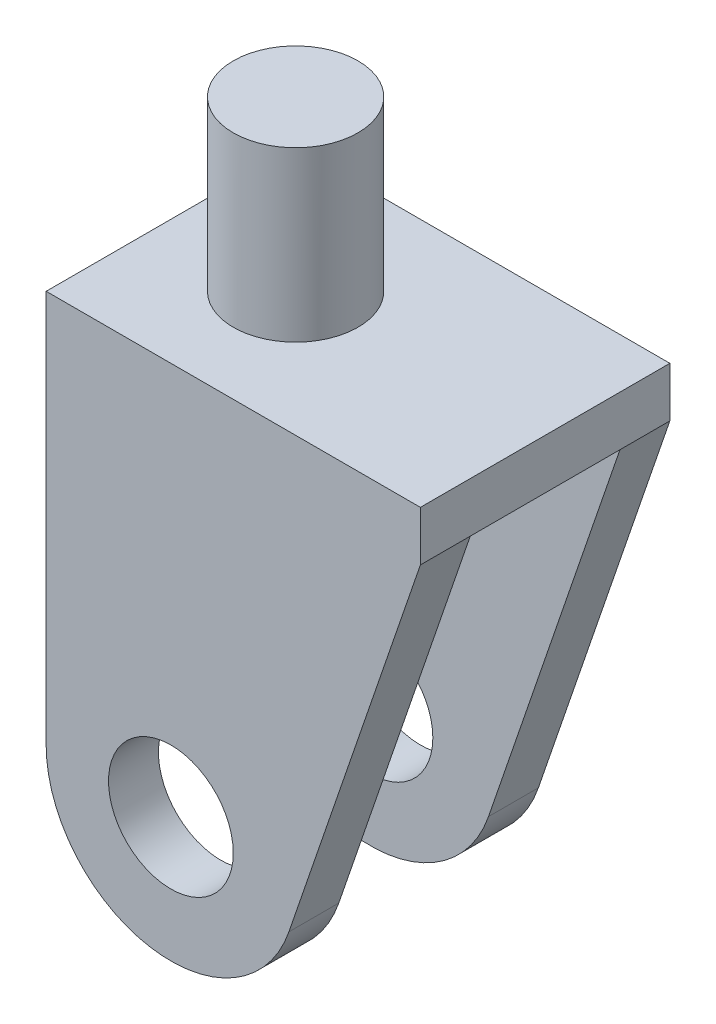
ISO-10303-21;
HEADER;
FILE_DESCRIPTION(('STEP AP214'),'2;1');
FILE_NAME('part.step','',(''),(''),'','','');
FILE_SCHEMA(('AUTOMOTIVE_DESIGN { 1 0 10303 214 1 1 1 1 }'));
ENDSEC;
DATA;
#1=APPLICATION_CONTEXT('core data for automotive mechanical design processes');
#2=APPLICATION_PROTOCOL_DEFINITION('international standard','automotive_design',2000,#1);
#3=PRODUCT_CONTEXT('',#1,'mechanical');
#4=PRODUCT('Part','Part','',(#3));
#5=PRODUCT_RELATED_PRODUCT_CATEGORY('part','',(#4));
#6=PRODUCT_DEFINITION_FORMATION('','',#4);
#7=PRODUCT_DEFINITION_CONTEXT('part definition',#1,'design');
#8=PRODUCT_DEFINITION('design','',#6,#7);
#9=PRODUCT_DEFINITION_SHAPE('','',#8);
#10=(LENGTH_UNIT() NAMED_UNIT(*) SI_UNIT(.MILLI.,.METRE.));
#11=(NAMED_UNIT(*) PLANE_ANGLE_UNIT() SI_UNIT($,.RADIAN.));
#12=(NAMED_UNIT(*) SI_UNIT($,.STERADIAN.) SOLID_ANGLE_UNIT());
#13=UNCERTAINTY_MEASURE_WITH_UNIT(LENGTH_MEASURE(1.E-05),#10,'distance_accuracy_value','');
#14=(GEOMETRIC_REPRESENTATION_CONTEXT(3) GLOBAL_UNCERTAINTY_ASSIGNED_CONTEXT((#13)) GLOBAL_UNIT_ASSIGNED_CONTEXT((#10,
#11,#12)) REPRESENTATION_CONTEXT('',''));
#15=CARTESIAN_POINT('',(0.,0.,0.));
#16=DIRECTION('',(0.,0.,1.));
#17=DIRECTION('',(1.,0.,0.));
#18=AXIS2_PLACEMENT_3D('',#15,#16,#17);
#19=CARTESIAN_POINT('',(-20.0000001154631,55.,20.));
#20=DIRECTION('',(1.,0.,0.));
#21=DIRECTION('',(0.,1.,0.));
#22=AXIS2_PLACEMENT_3D('',#19,#20,#21);
#23=PLANE('',#22);
#24=DIRECTION('',(0.,-1.,0.));
#25=VECTOR('',#24,1.);
#26=CARTESIAN_POINT('',(-20.0000001154631,55.,-12.));
#27=LINE('',#26,#25);
#28=CARTESIAN_POINT('',(-20.0000001154631,55.,-12.));
#29=VERTEX_POINT('',#28);
#30=CARTESIAN_POINT('',(-20.0000001154631,0.,-12.));
#31=VERTEX_POINT('',#30);
#32=EDGE_CURVE('E196',#29,#31,#27,.T.);
#33=ORIENTED_EDGE('',*,*,#32,.F.);
#34=DIRECTION('',(0.,0.,1.));
#35=VECTOR('',#34,1.);
#36=CARTESIAN_POINT('',(-20.0000001154631,55.,-12.));
#37=LINE('',#36,#35);
#38=CARTESIAN_POINT('',(-20.0000001154631,55.,12.));
#39=VERTEX_POINT('',#38);
#40=EDGE_CURVE('E151',#29,#39,#37,.T.);
#41=ORIENTED_EDGE('',*,*,#40,.T.);
#42=DIRECTION('',(0.,-1.,0.));
#43=VECTOR('',#42,1.);
#44=CARTESIAN_POINT('',(-20.0000001154631,55.,12.));
#45=LINE('',#44,#43);
#46=CARTESIAN_POINT('',(-20.0000001154631,0.,12.));
#47=VERTEX_POINT('',#46);
#48=EDGE_CURVE('E113',#39,#47,#45,.T.);
#49=ORIENTED_EDGE('',*,*,#48,.T.);
#50=DIRECTION('',(0.,0.,-1.));
#51=VECTOR('',#50,1.);
#52=CARTESIAN_POINT('',(-20.0000001154631,0.,20.));
#53=LINE('',#52,#51);
#54=CARTESIAN_POINT('',(-20.0000001154631,0.,20.));
#55=VERTEX_POINT('',#54);
#56=EDGE_CURVE('E110',#55,#47,#53,.T.);
#57=ORIENTED_EDGE('',*,*,#56,.F.);
#58=DIRECTION('',(0.,-1.,0.));
#59=VECTOR('',#58,1.);
#60=CARTESIAN_POINT('',(-20.0000001154631,55.,20.));
#61=LINE('',#60,#59);
#62=CARTESIAN_POINT('',(-20.0000001154631,63.,20.));
#63=VERTEX_POINT('',#62);
#64=EDGE_CURVE('E98',#63,#55,#61,.T.);
#65=ORIENTED_EDGE('',*,*,#64,.F.);
#66=DIRECTION('',(0.,0.,-1.));
#67=VECTOR('',#66,1.);
#68=CARTESIAN_POINT('',(-20.0000001154631,63.,20.));
#69=LINE('',#68,#67);
#70=CARTESIAN_POINT('',(-20.0000001154631,63.,-20.));
#71=VERTEX_POINT('',#70);
#72=EDGE_CURVE('E116',#63,#71,#69,.T.);
#73=ORIENTED_EDGE('',*,*,#72,.T.);
#74=DIRECTION('',(0.,-1.,0.));
#75=VECTOR('',#74,1.);
#76=CARTESIAN_POINT('',(-20.0000001154631,55.,-20.));
#77=LINE('',#76,#75);
#78=CARTESIAN_POINT('',(-20.0000001154631,0.,-20.));
#79=VERTEX_POINT('',#78);
#80=EDGE_CURVE('E132',#71,#79,#77,.T.);
#81=ORIENTED_EDGE('',*,*,#80,.T.);
#82=EDGE_CURVE('E117',#31,#79,#53,.T.);
#83=ORIENTED_EDGE('',*,*,#82,.F.);
#84=EDGE_LOOP('',(#33,#41,#49,#57,#65,#73,#81,#83));
#85=FACE_BOUND('',#84,.T.);
#86=ADVANCED_FACE('F33',(#85),#23,.F.);
#87=CARTESIAN_POINT('',(0.,0.,20.));
#88=DIRECTION('',(0.,0.,-1.));
#89=DIRECTION('',(-1.,0.,0.));
#90=AXIS2_PLACEMENT_3D('',#87,#88,#89);
#91=CYLINDRICAL_SURFACE('',#90,20.0000001154631);
#92=CARTESIAN_POINT('',(0.,0.,-12.));
#93=DIRECTION('',(0.,0.,1.));
#94=DIRECTION('',(1.,0.,0.));
#95=AXIS2_PLACEMENT_3D('',#92,#93,#94);
#96=CIRCLE('',#95,20.0000001154631);
#97=CARTESIAN_POINT('',(18.9189190396631,-6.48648649032726,-12.));
#98=VERTEX_POINT('',#97);
#99=EDGE_CURVE('E179',#31,#98,#96,.T.);
#100=ORIENTED_EDGE('',*,*,#99,.F.);
#101=ORIENTED_EDGE('',*,*,#82,.T.);
#102=CARTESIAN_POINT('',(0.,0.,-20.));
#103=DIRECTION('',(0.,0.,1.));
#104=DIRECTION('',(1.,0.,0.));
#105=AXIS2_PLACEMENT_3D('',#102,#103,#104);
#106=CIRCLE('',#105,20.0000001154631);
#107=CARTESIAN_POINT('',(18.9189190396631,-6.48648649032726,-20.));
#108=VERTEX_POINT('',#107);
#109=EDGE_CURVE('E135',#79,#108,#106,.T.);
#110=ORIENTED_EDGE('',*,*,#109,.T.);
#111=DIRECTION('',(0.,0.,-1.));
#112=VECTOR('',#111,1.);
#113=CARTESIAN_POINT('',(18.9189190396631,-6.48648649032726,20.));
#114=LINE('',#113,#112);
#115=EDGE_CURVE('E144',#98,#108,#114,.T.);
#116=ORIENTED_EDGE('',*,*,#115,.F.);
#117=EDGE_LOOP('',(#100,#101,#110,#116));
#118=FACE_BOUND('',#117,.T.);
#119=ADVANCED_FACE('F176',(#118),#91,.T.);
#120=CARTESIAN_POINT('',(40.,55.,20.));
#121=DIRECTION('',(-0.945945946522061,0.324324322643988,0.));
#122=DIRECTION('',(-0.324324322643988,-0.945945946522061,0.));
#123=AXIS2_PLACEMENT_3D('',#120,#121,#122);
#124=PLANE('',#123);
#125=DIRECTION('',(0.324324322643988,0.945945946522061,0.));
#126=VECTOR('',#125,1.);
#127=CARTESIAN_POINT('',(18.9189190396631,-6.48648649032726,-12.));
#128=LINE('',#127,#126);
#129=CARTESIAN_POINT('',(40.,55.,-12.));
#130=VERTEX_POINT('',#129);
#131=EDGE_CURVE('E186',#98,#130,#128,.T.);
#132=ORIENTED_EDGE('',*,*,#131,.F.);
#133=ORIENTED_EDGE('',*,*,#115,.T.);
#134=DIRECTION('',(0.324324322643988,0.945945946522061,0.));
#135=VECTOR('',#134,1.);
#136=CARTESIAN_POINT('',(40.,55.,-20.));
#137=LINE('',#136,#135);
#138=CARTESIAN_POINT('',(40.,55.,-20.));
#139=VERTEX_POINT('',#138);
#140=EDGE_CURVE('E138',#108,#139,#137,.T.);
#141=ORIENTED_EDGE('',*,*,#140,.T.);
#142=DIRECTION('',(0.,0.,-1.));
#143=VECTOR('',#142,1.);
#144=CARTESIAN_POINT('',(40.,55.,20.));
#145=LINE('',#144,#143);
#146=EDGE_CURVE('E82',#130,#139,#145,.T.);
#147=ORIENTED_EDGE('',*,*,#146,.F.);
#148=EDGE_LOOP('',(#132,#133,#141,#147));
#149=FACE_BOUND('',#148,.T.);
#150=ADVANCED_FACE('F222',(#149),#124,.F.);
#151=CARTESIAN_POINT('',(0.,0.,20.));
#152=DIRECTION('',(0.,0.,-1.));
#153=DIRECTION('',(-1.,0.,0.));
#154=AXIS2_PLACEMENT_3D('',#151,#152,#153);
#155=CYLINDRICAL_SURFACE('',#154,10.);
#156=CARTESIAN_POINT('',(0.,0.,-20.));
#157=DIRECTION('',(0.,0.,1.));
#158=DIRECTION('',(1.,0.,0.));
#159=AXIS2_PLACEMENT_3D('',#156,#157,#158);
#160=CIRCLE('',#159,10.);
#161=CARTESIAN_POINT('',(10.,0.,-20.));
#162=VERTEX_POINT('',#161);
#163=EDGE_CURVE('E153',#162,#162,#160,.T.);
#164=ORIENTED_EDGE('',*,*,#163,.F.);
#165=EDGE_LOOP('',(#164));
#166=FACE_BOUND('',#165,.T.);
#167=CARTESIAN_POINT('',(0.,0.,-12.));
#168=DIRECTION('',(0.,0.,1.));
#169=DIRECTION('',(1.,0.,0.));
#170=AXIS2_PLACEMENT_3D('',#167,#168,#169);
#171=CIRCLE('',#170,10.);
#172=CARTESIAN_POINT('',(10.,0.,-12.));
#173=VERTEX_POINT('',#172);
#174=EDGE_CURVE('E150',#173,#173,#171,.T.);
#175=ORIENTED_EDGE('',*,*,#174,.T.);
#176=EDGE_LOOP('',(#175));
#177=FACE_BOUND('',#176,.T.);
#178=ADVANCED_FACE('F224',(#166,#177),#155,.F.);
#179=CARTESIAN_POINT('',(0.,0.,20.));
#180=DIRECTION('',(0.,0.,1.));
#181=DIRECTION('',(1.,0.,0.));
#182=AXIS2_PLACEMENT_3D('',#179,#180,#181);
#183=PLANE('',#182);
#184=DIRECTION('',(0.,1.,0.));
#185=VECTOR('',#184,1.);
#186=CARTESIAN_POINT('',(40.,63.,20.));
#187=LINE('',#186,#185);
#188=CARTESIAN_POINT('',(40.,55.,20.));
#189=VERTEX_POINT('',#188);
#190=CARTESIAN_POINT('',(40.,63.,20.));
#191=VERTEX_POINT('',#190);
#192=EDGE_CURVE('E140',#189,#191,#187,.T.);
#193=ORIENTED_EDGE('',*,*,#192,.T.);
#194=DIRECTION('',(-1.,0.,0.));
#195=VECTOR('',#194,1.);
#196=CARTESIAN_POINT('',(-20.0000001154631,63.,20.));
#197=LINE('',#196,#195);
#198=EDGE_CURVE('E91',#191,#63,#197,.T.);
#199=ORIENTED_EDGE('',*,*,#198,.T.);
#200=ORIENTED_EDGE('',*,*,#64,.T.);
#201=CARTESIAN_POINT('',(0.,0.,20.));
#202=DIRECTION('',(0.,0.,1.));
#203=DIRECTION('',(1.,0.,0.));
#204=AXIS2_PLACEMENT_3D('',#201,#202,#203);
#205=CIRCLE('',#204,20.0000001154631);
#206=CARTESIAN_POINT('',(18.9189190396631,-6.48648649032726,20.));
#207=VERTEX_POINT('',#206);
#208=EDGE_CURVE('E103',#55,#207,#205,.T.);
#209=ORIENTED_EDGE('',*,*,#208,.T.);
#210=DIRECTION('',(0.324324322643988,0.945945946522061,0.));
#211=VECTOR('',#210,1.);
#212=CARTESIAN_POINT('',(40.,55.,20.));
#213=LINE('',#212,#211);
#214=EDGE_CURVE('E57',#207,#189,#213,.T.);
#215=ORIENTED_EDGE('',*,*,#214,.T.);
#216=EDGE_LOOP('',(#193,#199,#200,#209,#215));
#217=FACE_BOUND('',#216,.T.);
#218=CARTESIAN_POINT('',(0.,0.,20.));
#219=DIRECTION('',(0.,0.,1.));
#220=DIRECTION('',(1.,0.,0.));
#221=AXIS2_PLACEMENT_3D('',#218,#219,#220);
#222=CIRCLE('',#221,10.);
#223=CARTESIAN_POINT('',(10.,0.,20.));
#224=VERTEX_POINT('',#223);
#225=EDGE_CURVE('E129',#224,#224,#222,.T.);
#226=ORIENTED_EDGE('',*,*,#225,.F.);
#227=EDGE_LOOP('',(#226));
#228=FACE_BOUND('',#227,.T.);
#229=ADVANCED_FACE('F100',(#217,#228),#183,.T.);
#230=CARTESIAN_POINT('',(0.,0.,-20.));
#231=DIRECTION('',(0.,0.,1.));
#232=DIRECTION('',(1.,0.,0.));
#233=AXIS2_PLACEMENT_3D('',#230,#231,#232);
#234=PLANE('',#233);
#235=DIRECTION('',(0.,1.,0.));
#236=VECTOR('',#235,1.);
#237=CARTESIAN_POINT('',(40.,63.,-20.));
#238=LINE('',#237,#236);
#239=CARTESIAN_POINT('',(40.,63.,-20.));
#240=VERTEX_POINT('',#239);
#241=EDGE_CURVE('E126',#139,#240,#238,.T.);
#242=ORIENTED_EDGE('',*,*,#241,.F.);
#243=ORIENTED_EDGE('',*,*,#140,.F.);
#244=ORIENTED_EDGE('',*,*,#109,.F.);
#245=ORIENTED_EDGE('',*,*,#80,.F.);
#246=DIRECTION('',(-1.,0.,0.));
#247=VECTOR('',#246,1.);
#248=CARTESIAN_POINT('',(-20.0000001154631,63.,-20.));
#249=LINE('',#248,#247);
#250=EDGE_CURVE('E128',#240,#71,#249,.T.);
#251=ORIENTED_EDGE('',*,*,#250,.F.);
#252=EDGE_LOOP('',(#242,#243,#244,#245,#251));
#253=FACE_BOUND('',#252,.T.);
#254=ORIENTED_EDGE('',*,*,#163,.T.);
#255=EDGE_LOOP('',(#254));
#256=FACE_BOUND('',#255,.T.);
#257=ADVANCED_FACE('F172',(#253,#256),#234,.F.);
#258=CARTESIAN_POINT('',(40.,63.,20.));
#259=DIRECTION('',(-1.,0.,0.));
#260=DIRECTION('',(0.,0.,1.));
#261=AXIS2_PLACEMENT_3D('',#258,#259,#260);
#262=PLANE('',#261);
#263=ORIENTED_EDGE('',*,*,#241,.T.);
#264=DIRECTION('',(0.,0.,-1.));
#265=VECTOR('',#264,1.);
#266=CARTESIAN_POINT('',(40.,63.,20.));
#267=LINE('',#266,#265);
#268=EDGE_CURVE('E41',#191,#240,#267,.T.);
#269=ORIENTED_EDGE('',*,*,#268,.F.);
#270=ORIENTED_EDGE('',*,*,#192,.F.);
#271=CARTESIAN_POINT('',(40.,55.,12.));
#272=VERTEX_POINT('',#271);
#273=EDGE_CURVE('E141',#189,#272,#145,.T.);
#274=ORIENTED_EDGE('',*,*,#273,.T.);
#275=DIRECTION('',(0.,0.,1.));
#276=VECTOR('',#275,1.);
#277=CARTESIAN_POINT('',(40.,55.,-12.));
#278=LINE('',#277,#276);
#279=EDGE_CURVE('E198',#130,#272,#278,.T.);
#280=ORIENTED_EDGE('',*,*,#279,.F.);
#281=ORIENTED_EDGE('',*,*,#146,.T.);
#282=EDGE_LOOP('',(#263,#269,#270,#274,#280,#281));
#283=FACE_BOUND('',#282,.T.);
#284=ADVANCED_FACE('F35',(#283),#262,.F.);
#285=CARTESIAN_POINT('',(-20.0000001154631,63.,20.));
#286=DIRECTION('',(0.,-1.,0.));
#287=DIRECTION('',(0.,0.,-1.));
#288=AXIS2_PLACEMENT_3D('',#285,#286,#287);
#289=PLANE('',#288);
#290=CARTESIAN_POINT('',(0.,63.,0.));
#291=DIRECTION('',(0.,-1.,0.));
#292=DIRECTION('',(0.,0.,-1.));
#293=AXIS2_PLACEMENT_3D('',#290,#291,#292);
#294=CIRCLE('',#293,10.);
#295=CARTESIAN_POINT('',(0.,63.,-10.));
#296=VERTEX_POINT('',#295);
#297=EDGE_CURVE('E11',#296,#296,#294,.F.);
#298=ORIENTED_EDGE('',*,*,#297,.F.);
#299=EDGE_LOOP('',(#298));
#300=FACE_BOUND('',#299,.T.);
#301=ORIENTED_EDGE('',*,*,#250,.T.);
#302=ORIENTED_EDGE('',*,*,#72,.F.);
#303=ORIENTED_EDGE('',*,*,#198,.F.);
#304=ORIENTED_EDGE('',*,*,#268,.T.);
#305=EDGE_LOOP('',(#301,#302,#303,#304));
#306=FACE_BOUND('',#305,.T.);
#307=ADVANCED_FACE('F167',(#300,#306),#289,.F.);
#308=ORIENTED_EDGE('',*,*,#56,.T.);
#309=CARTESIAN_POINT('',(0.,0.,12.));
#310=DIRECTION('',(0.,0.,1.));
#311=DIRECTION('',(1.,0.,0.));
#312=AXIS2_PLACEMENT_3D('',#309,#310,#311);
#313=CIRCLE('',#312,20.0000001154631);
#314=CARTESIAN_POINT('',(18.9189190396631,-6.48648649032726,12.));
#315=VERTEX_POINT('',#314);
#316=EDGE_CURVE('E199',#47,#315,#313,.T.);
#317=ORIENTED_EDGE('',*,*,#316,.T.);
#318=EDGE_CURVE('E121',#207,#315,#114,.T.);
#319=ORIENTED_EDGE('',*,*,#318,.F.);
#320=ORIENTED_EDGE('',*,*,#208,.F.);
#321=EDGE_LOOP('',(#308,#317,#319,#320));
#322=FACE_BOUND('',#321,.T.);
#323=ADVANCED_FACE('F119',(#322),#91,.T.);
#324=ORIENTED_EDGE('',*,*,#318,.T.);
#325=DIRECTION('',(0.324324322643988,0.945945946522061,0.));
#326=VECTOR('',#325,1.);
#327=CARTESIAN_POINT('',(18.9189190396631,-6.48648649032726,12.));
#328=LINE('',#327,#326);
#329=EDGE_CURVE('E201',#315,#272,#328,.T.);
#330=ORIENTED_EDGE('',*,*,#329,.T.);
#331=ORIENTED_EDGE('',*,*,#273,.F.);
#332=ORIENTED_EDGE('',*,*,#214,.F.);
#333=EDGE_LOOP('',(#324,#330,#331,#332));
#334=FACE_BOUND('',#333,.T.);
#335=ADVANCED_FACE('F212',(#334),#124,.F.);
#336=CARTESIAN_POINT('',(0.,0.,12.));
#337=DIRECTION('',(0.,0.,1.));
#338=DIRECTION('',(1.,0.,0.));
#339=AXIS2_PLACEMENT_3D('',#336,#337,#338);
#340=CIRCLE('',#339,10.);
#341=CARTESIAN_POINT('',(10.,0.,12.));
#342=VERTEX_POINT('',#341);
#343=EDGE_CURVE('E148',#342,#342,#340,.T.);
#344=ORIENTED_EDGE('',*,*,#343,.F.);
#345=EDGE_LOOP('',(#344));
#346=FACE_BOUND('',#345,.T.);
#347=ORIENTED_EDGE('',*,*,#225,.T.);
#348=EDGE_LOOP('',(#347));
#349=FACE_BOUND('',#348,.T.);
#350=ADVANCED_FACE('F232',(#346,#349),#155,.F.);
#351=CARTESIAN_POINT('',(40.,55.,-12.));
#352=DIRECTION('',(0.,1.,0.));
#353=DIRECTION('',(0.,0.,1.));
#354=AXIS2_PLACEMENT_3D('',#351,#352,#353);
#355=PLANE('',#354);
#356=DIRECTION('',(-1.,0.,0.));
#357=VECTOR('',#356,1.);
#358=CARTESIAN_POINT('',(40.,55.,12.));
#359=LINE('',#358,#357);
#360=EDGE_CURVE('E48',#272,#39,#359,.T.);
#361=ORIENTED_EDGE('',*,*,#360,.T.);
#362=ORIENTED_EDGE('',*,*,#40,.F.);
#363=DIRECTION('',(-1.,0.,0.));
#364=VECTOR('',#363,1.);
#365=CARTESIAN_POINT('',(40.,55.,-12.));
#366=LINE('',#365,#364);
#367=EDGE_CURVE('E188',#130,#29,#366,.T.);
#368=ORIENTED_EDGE('',*,*,#367,.F.);
#369=ORIENTED_EDGE('',*,*,#279,.T.);
#370=EDGE_LOOP('',(#361,#362,#368,#369));
#371=FACE_BOUND('',#370,.T.);
#372=ADVANCED_FACE('F207',(#371),#355,.F.);
#373=CARTESIAN_POINT('',(0.,0.,-12.));
#374=DIRECTION('',(0.,0.,1.));
#375=DIRECTION('',(1.,0.,0.));
#376=AXIS2_PLACEMENT_3D('',#373,#374,#375);
#377=PLANE('',#376);
#378=ORIENTED_EDGE('',*,*,#174,.F.);
#379=EDGE_LOOP('',(#378));
#380=FACE_BOUND('',#379,.T.);
#381=ORIENTED_EDGE('',*,*,#99,.T.);
#382=ORIENTED_EDGE('',*,*,#131,.T.);
#383=ORIENTED_EDGE('',*,*,#367,.T.);
#384=ORIENTED_EDGE('',*,*,#32,.T.);
#385=EDGE_LOOP('',(#381,#382,#383,#384));
#386=FACE_BOUND('',#385,.T.);
#387=ADVANCED_FACE('F220',(#380,#386),#377,.T.);
#388=CARTESIAN_POINT('',(0.,0.,12.));
#389=DIRECTION('',(0.,0.,1.));
#390=DIRECTION('',(1.,0.,0.));
#391=AXIS2_PLACEMENT_3D('',#388,#389,#390);
#392=PLANE('',#391);
#393=ORIENTED_EDGE('',*,*,#343,.T.);
#394=EDGE_LOOP('',(#393));
#395=FACE_BOUND('',#394,.T.);
#396=ORIENTED_EDGE('',*,*,#316,.F.);
#397=ORIENTED_EDGE('',*,*,#48,.F.);
#398=ORIENTED_EDGE('',*,*,#360,.F.);
#399=ORIENTED_EDGE('',*,*,#329,.F.);
#400=EDGE_LOOP('',(#396,#397,#398,#399));
#401=FACE_BOUND('',#400,.T.);
#402=ADVANCED_FACE('F215',(#395,#401),#392,.F.);
#403=CARTESIAN_POINT('',(0.,90.,0.));
#404=DIRECTION('',(0.,-1.,0.));
#405=DIRECTION('',(0.,0.,-1.));
#406=AXIS2_PLACEMENT_3D('',#403,#404,#405);
#407=CYLINDRICAL_SURFACE('',#406,10.);
#408=CARTESIAN_POINT('',(0.,90.,0.));
#409=DIRECTION('',(0.,1.,0.));
#410=DIRECTION('',(0.,0.,1.));
#411=AXIS2_PLACEMENT_3D('',#408,#409,#410);
#412=CIRCLE('',#411,10.);
#413=CARTESIAN_POINT('',(0.,90.,10.));
#414=VERTEX_POINT('',#413);
#415=EDGE_CURVE('E192',#414,#414,#412,.T.);
#416=ORIENTED_EDGE('',*,*,#415,.F.);
#417=EDGE_LOOP('',(#416));
#418=FACE_BOUND('',#417,.T.);
#419=ORIENTED_EDGE('',*,*,#297,.T.);
#420=EDGE_LOOP('',(#419));
#421=FACE_BOUND('',#420,.T.);
#422=ADVANCED_FACE('F248',(#418,#421),#407,.T.);
#423=CARTESIAN_POINT('',(0.,90.,0.));
#424=DIRECTION('',(0.,1.,0.));
#425=DIRECTION('',(0.,0.,1.));
#426=AXIS2_PLACEMENT_3D('',#423,#424,#425);
#427=PLANE('',#426);
#428=ORIENTED_EDGE('',*,*,#415,.T.);
#429=EDGE_LOOP('',(#428));
#430=FACE_BOUND('',#429,.T.);
#431=ADVANCED_FACE('F250',(#430),#427,.T.);
#432=CLOSED_SHELL('',(#86,#119,#150,#178,#229,#257,#284,#307,#323,#335,#350,#372,#387,#402,#422,#431));
#433=MANIFOLD_SOLID_BREP('B2',#432);
#434=ADVANCED_BREP_SHAPE_REPRESENTATION('',(#18,#433),#14);
#435=SHAPE_DEFINITION_REPRESENTATION(#9,#434);
ENDSEC;
END-ISO-10303-21;
